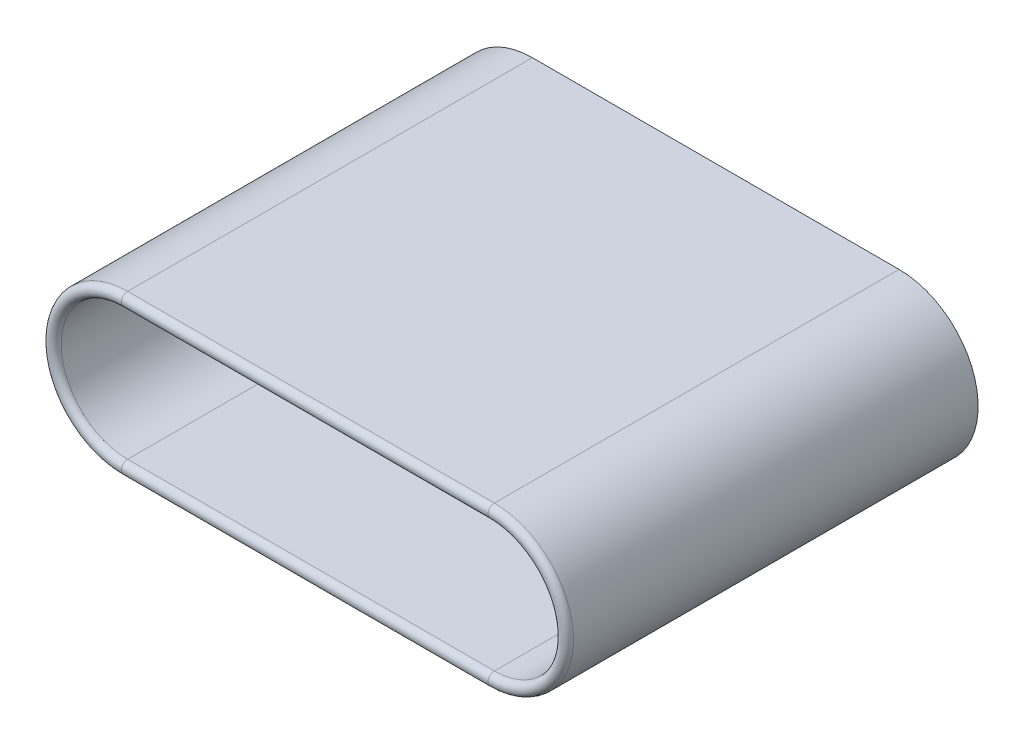
ISO-10303-21;
HEADER;
FILE_DESCRIPTION(('STEP AP214'),'2;1');
FILE_NAME('part.step','',(''),(''),'','','');
FILE_SCHEMA(('AUTOMOTIVE_DESIGN { 1 0 10303 214 1 1 1 1 }'));
ENDSEC;
DATA;
#1=APPLICATION_CONTEXT('core data for automotive mechanical design processes');
#2=APPLICATION_PROTOCOL_DEFINITION('international standard','automotive_design',2000,#1);
#3=PRODUCT_CONTEXT('',#1,'mechanical');
#4=PRODUCT('Part','Part','',(#3));
#5=PRODUCT_RELATED_PRODUCT_CATEGORY('part','',(#4));
#6=PRODUCT_DEFINITION_FORMATION('','',#4);
#7=PRODUCT_DEFINITION_CONTEXT('part definition',#1,'design');
#8=PRODUCT_DEFINITION('design','',#6,#7);
#9=PRODUCT_DEFINITION_SHAPE('','',#8);
#10=(LENGTH_UNIT() NAMED_UNIT(*) SI_UNIT(.MILLI.,.METRE.));
#11=(NAMED_UNIT(*) PLANE_ANGLE_UNIT() SI_UNIT($,.RADIAN.));
#12=(NAMED_UNIT(*) SI_UNIT($,.STERADIAN.) SOLID_ANGLE_UNIT());
#13=UNCERTAINTY_MEASURE_WITH_UNIT(LENGTH_MEASURE(1.E-05),#10,'distance_accuracy_value','');
#14=(GEOMETRIC_REPRESENTATION_CONTEXT(3) GLOBAL_UNCERTAINTY_ASSIGNED_CONTEXT((#13)) GLOBAL_UNIT_ASSIGNED_CONTEXT((#10,
#11,#12)) REPRESENTATION_CONTEXT('',''));
#15=CARTESIAN_POINT('',(0.,0.,0.));
#16=DIRECTION('',(0.,0.,1.));
#17=DIRECTION('',(1.,0.,0.));
#18=AXIS2_PLACEMENT_3D('',#15,#16,#17);
#19=CARTESIAN_POINT('',(2.9,1.05,0.));
#20=DIRECTION('',(0.,1.,0.));
#21=DIRECTION('',(-1.,0.,0.));
#22=AXIS2_PLACEMENT_3D('',#19,#20,#21);
#23=PLANE('',#22);
#24=DIRECTION('',(0.,0.,1.));
#25=VECTOR('',#24,1.);
#26=CARTESIAN_POINT('',(-2.9,1.05,0.));
#27=LINE('',#26,#25);
#28=CARTESIAN_POINT('',(-2.9,1.05,3.15));
#29=VERTEX_POINT('',#28);
#30=CARTESIAN_POINT('',(-2.9,1.05,-3.05));
#31=VERTEX_POINT('',#30);
#32=EDGE_CURVE('E62',#29,#31,#27,.F.);
#33=ORIENTED_EDGE('',*,*,#32,.T.);
#34=DIRECTION('',(-1.,0.,0.));
#35=VECTOR('',#34,1.);
#36=CARTESIAN_POINT('',(0.,1.05,-3.05));
#37=LINE('',#36,#35);
#38=CARTESIAN_POINT('',(2.9,1.05,-3.05));
#39=VERTEX_POINT('',#38);
#40=EDGE_CURVE('E65',#31,#39,#37,.F.);
#41=ORIENTED_EDGE('',*,*,#40,.T.);
#42=DIRECTION('',(0.,0.,1.));
#43=VECTOR('',#42,1.);
#44=CARTESIAN_POINT('',(2.9,1.05,0.));
#45=LINE('',#44,#43);
#46=CARTESIAN_POINT('',(2.9,1.05,3.15));
#47=VERTEX_POINT('',#46);
#48=EDGE_CURVE('E87',#39,#47,#45,.T.);
#49=ORIENTED_EDGE('',*,*,#48,.T.);
#50=DIRECTION('',(1.,0.,0.));
#51=VECTOR('',#50,1.);
#52=CARTESIAN_POINT('',(1.45,1.05,3.15));
#53=LINE('',#52,#51);
#54=EDGE_CURVE('E68',#29,#47,#53,.T.);
#55=ORIENTED_EDGE('',*,*,#54,.F.);
#56=EDGE_LOOP('',(#33,#41,#49,#55));
#57=FACE_BOUND('',#56,.T.);
#58=ADVANCED_FACE('F17',(#57),#23,.F.);
#59=CARTESIAN_POINT('',(0.,0.,-3.05));
#60=DIRECTION('',(0.,0.,-1.));
#61=DIRECTION('',(-1.,0.,0.));
#62=AXIS2_PLACEMENT_3D('',#59,#60,#61);
#63=PLANE('',#62);
#64=CARTESIAN_POINT('',(2.9,0.,-3.05));
#65=DIRECTION('',(0.,0.,1.));
#66=DIRECTION('',(1.,0.,0.));
#67=AXIS2_PLACEMENT_3D('',#64,#65,#66);
#68=CIRCLE('',#67,1.05);
#69=CARTESIAN_POINT('',(2.9,-1.05,-3.05));
#70=VERTEX_POINT('',#69);
#71=EDGE_CURVE('E80',#70,#39,#68,.T.);
#72=ORIENTED_EDGE('',*,*,#71,.T.);
#73=ORIENTED_EDGE('',*,*,#40,.F.);
#74=CARTESIAN_POINT('',(-2.9,0.,-3.05));
#75=DIRECTION('',(0.,0.,1.));
#76=DIRECTION('',(1.,0.,0.));
#77=AXIS2_PLACEMENT_3D('',#74,#75,#76);
#78=CIRCLE('',#77,1.05);
#79=CARTESIAN_POINT('',(-2.9,-1.05,-3.05));
#80=VERTEX_POINT('',#79);
#81=EDGE_CURVE('E20',#31,#80,#78,.T.);
#82=ORIENTED_EDGE('',*,*,#81,.T.);
#83=DIRECTION('',(1.,0.,0.));
#84=VECTOR('',#83,1.);
#85=CARTESIAN_POINT('',(-2.9,-1.05,-3.05));
#86=LINE('',#85,#84);
#87=EDGE_CURVE('E98',#80,#70,#86,.T.);
#88=ORIENTED_EDGE('',*,*,#87,.T.);
#89=EDGE_LOOP('',(#72,#73,#82,#88));
#90=FACE_BOUND('',#89,.T.);
#91=ADVANCED_FACE('F77',(#90),#63,.F.);
#92=CARTESIAN_POINT('',(-2.9,0.,0.));
#93=DIRECTION('',(0.,0.,1.));
#94=DIRECTION('',(1.,0.,0.));
#95=AXIS2_PLACEMENT_3D('',#92,#93,#94);
#96=CYLINDRICAL_SURFACE('',#95,1.05);
#97=DIRECTION('',(0.,0.,1.));
#98=VECTOR('',#97,1.);
#99=CARTESIAN_POINT('',(-2.9,-1.05,0.));
#100=LINE('',#99,#98);
#101=CARTESIAN_POINT('',(-2.9,-1.05,3.15));
#102=VERTEX_POINT('',#101);
#103=EDGE_CURVE('E85',#102,#80,#100,.F.);
#104=ORIENTED_EDGE('',*,*,#103,.T.);
#105=ORIENTED_EDGE('',*,*,#81,.F.);
#106=ORIENTED_EDGE('',*,*,#32,.F.);
#107=CARTESIAN_POINT('',(-2.9,0.,3.15));
#108=DIRECTION('',(0.,0.,-1.));
#109=DIRECTION('',(-1.,0.,0.));
#110=AXIS2_PLACEMENT_3D('',#107,#108,#109);
#111=CIRCLE('',#110,1.05);
#112=EDGE_CURVE('E113',#102,#29,#111,.T.);
#113=ORIENTED_EDGE('',*,*,#112,.F.);
#114=EDGE_LOOP('',(#104,#105,#106,#113));
#115=FACE_BOUND('',#114,.T.);
#116=ADVANCED_FACE('F83',(#115),#96,.F.);
#117=CARTESIAN_POINT('',(2.9,0.,0.));
#118=DIRECTION('',(0.,0.,1.));
#119=DIRECTION('',(1.,0.,0.));
#120=AXIS2_PLACEMENT_3D('',#117,#118,#119);
#121=CYLINDRICAL_SURFACE('',#120,1.05);
#122=ORIENTED_EDGE('',*,*,#48,.F.);
#123=ORIENTED_EDGE('',*,*,#71,.F.);
#124=DIRECTION('',(0.,0.,1.));
#125=VECTOR('',#124,1.);
#126=CARTESIAN_POINT('',(2.9,-1.05,0.));
#127=LINE('',#126,#125);
#128=CARTESIAN_POINT('',(2.9,-1.05,3.15));
#129=VERTEX_POINT('',#128);
#130=EDGE_CURVE('E100',#70,#129,#127,.T.);
#131=ORIENTED_EDGE('',*,*,#130,.T.);
#132=CARTESIAN_POINT('',(2.9,0.,3.15));
#133=DIRECTION('',(0.,0.,-1.));
#134=DIRECTION('',(-1.,0.,0.));
#135=AXIS2_PLACEMENT_3D('',#132,#133,#134);
#136=CIRCLE('',#135,1.05);
#137=EDGE_CURVE('E130',#47,#129,#136,.T.);
#138=ORIENTED_EDGE('',*,*,#137,.F.);
#139=EDGE_LOOP('',(#122,#123,#131,#138));
#140=FACE_BOUND('',#139,.T.);
#141=ADVANCED_FACE('F158',(#140),#121,.F.);
#142=CARTESIAN_POINT('',(1.45,1.15,3.15));
#143=DIRECTION('',(1.,0.,0.));
#144=DIRECTION('',(0.,1.,0.));
#145=AXIS2_PLACEMENT_3D('',#142,#143,#144);
#146=CYLINDRICAL_SURFACE('',#145,0.1);
#147=CARTESIAN_POINT('',(-2.9,1.15,3.15));
#148=DIRECTION('',(1.,0.,0.));
#149=DIRECTION('',(0.,1.,0.));
#150=AXIS2_PLACEMENT_3D('',#147,#148,#149);
#151=CIRCLE('',#150,0.1);
#152=CARTESIAN_POINT('',(-2.9,1.25,3.15));
#153=VERTEX_POINT('',#152);
#154=EDGE_CURVE('E116',#29,#153,#151,.F.);
#155=ORIENTED_EDGE('',*,*,#154,.F.);
#156=ORIENTED_EDGE('',*,*,#54,.T.);
#157=CARTESIAN_POINT('',(2.9,1.15,3.15));
#158=DIRECTION('',(1.,0.,0.));
#159=DIRECTION('',(0.,1.,0.));
#160=AXIS2_PLACEMENT_3D('',#157,#158,#159);
#161=CIRCLE('',#160,0.1);
#162=CARTESIAN_POINT('',(2.9,1.25,3.15));
#163=VERTEX_POINT('',#162);
#164=EDGE_CURVE('E115',#163,#47,#161,.T.);
#165=ORIENTED_EDGE('',*,*,#164,.F.);
#166=DIRECTION('',(-1.,0.,0.));
#167=VECTOR('',#166,1.);
#168=CARTESIAN_POINT('',(2.9,1.25,3.15));
#169=LINE('',#168,#167);
#170=EDGE_CURVE('E133',#153,#163,#169,.F.);
#171=ORIENTED_EDGE('',*,*,#170,.F.);
#172=EDGE_LOOP('',(#155,#156,#165,#171));
#173=FACE_BOUND('',#172,.T.);
#174=ADVANCED_FACE('F154',(#173),#146,.T.);
#175=CARTESIAN_POINT('',(-2.9,-1.05,0.));
#176=DIRECTION('',(0.,-1.,0.));
#177=DIRECTION('',(1.,0.,0.));
#178=AXIS2_PLACEMENT_3D('',#175,#176,#177);
#179=PLANE('',#178);
#180=ORIENTED_EDGE('',*,*,#130,.F.);
#181=ORIENTED_EDGE('',*,*,#87,.F.);
#182=ORIENTED_EDGE('',*,*,#103,.F.);
#183=DIRECTION('',(-1.,0.,0.));
#184=VECTOR('',#183,1.);
#185=CARTESIAN_POINT('',(-1.45,-1.05,3.15));
#186=LINE('',#185,#184);
#187=EDGE_CURVE('E123',#129,#102,#186,.T.);
#188=ORIENTED_EDGE('',*,*,#187,.F.);
#189=EDGE_LOOP('',(#180,#181,#182,#188));
#190=FACE_BOUND('',#189,.T.);
#191=ADVANCED_FACE('F148',(#190),#179,.F.);
#192=CARTESIAN_POINT('',(-2.9,0.,3.15));
#193=DIRECTION('',(0.,0.,-1.));
#194=DIRECTION('',(-1.,0.,0.));
#195=AXIS2_PLACEMENT_3D('',#192,#193,#194);
#196=TOROIDAL_SURFACE('',#195,1.15,0.1);
#197=CARTESIAN_POINT('',(-2.9,-1.15,3.15));
#198=DIRECTION('',(-1.,0.,0.));
#199=DIRECTION('',(0.,-1.,0.));
#200=AXIS2_PLACEMENT_3D('',#197,#198,#199);
#201=CIRCLE('',#200,0.1);
#202=CARTESIAN_POINT('',(-2.9,-1.25,3.15));
#203=VERTEX_POINT('',#202);
#204=EDGE_CURVE('E215',#102,#203,#201,.F.);
#205=ORIENTED_EDGE('',*,*,#204,.F.);
#206=ORIENTED_EDGE('',*,*,#112,.T.);
#207=ORIENTED_EDGE('',*,*,#154,.T.);
#208=CARTESIAN_POINT('',(-2.9,0.,3.15));
#209=DIRECTION('',(0.,0.,1.));
#210=DIRECTION('',(1.,0.,0.));
#211=AXIS2_PLACEMENT_3D('',#208,#209,#210);
#212=CIRCLE('',#211,1.25);
#213=EDGE_CURVE('E126',#203,#153,#212,.F.);
#214=ORIENTED_EDGE('',*,*,#213,.F.);
#215=EDGE_LOOP('',(#205,#206,#207,#214));
#216=FACE_BOUND('',#215,.T.);
#217=ADVANCED_FACE('F143',(#216),#196,.T.);
#218=CARTESIAN_POINT('',(2.9,0.,3.15));
#219=DIRECTION('',(0.,0.,-1.));
#220=DIRECTION('',(-1.,0.,0.));
#221=AXIS2_PLACEMENT_3D('',#218,#219,#220);
#222=TOROIDAL_SURFACE('',#221,1.15,0.1);
#223=CARTESIAN_POINT('',(2.9,-1.15,3.15));
#224=DIRECTION('',(-1.,0.,0.));
#225=DIRECTION('',(0.,-1.,0.));
#226=AXIS2_PLACEMENT_3D('',#223,#224,#225);
#227=CIRCLE('',#226,0.1);
#228=CARTESIAN_POINT('',(2.9,-1.25,3.15));
#229=VERTEX_POINT('',#228);
#230=EDGE_CURVE('E127',#229,#129,#227,.T.);
#231=ORIENTED_EDGE('',*,*,#230,.F.);
#232=CARTESIAN_POINT('',(2.9,0.,3.15));
#233=DIRECTION('',(0.,0.,1.));
#234=DIRECTION('',(1.,0.,0.));
#235=AXIS2_PLACEMENT_3D('',#232,#233,#234);
#236=CIRCLE('',#235,1.25);
#237=EDGE_CURVE('E96',#163,#229,#236,.F.);
#238=ORIENTED_EDGE('',*,*,#237,.F.);
#239=ORIENTED_EDGE('',*,*,#164,.T.);
#240=ORIENTED_EDGE('',*,*,#137,.T.);
#241=EDGE_LOOP('',(#231,#238,#239,#240));
#242=FACE_BOUND('',#241,.T.);
#243=ADVANCED_FACE('F147',(#242),#222,.T.);
#244=CARTESIAN_POINT('',(2.9,1.25,0.));
#245=DIRECTION('',(0.,1.,0.));
#246=DIRECTION('',(-1.,0.,0.));
#247=AXIS2_PLACEMENT_3D('',#244,#245,#246);
#248=PLANE('',#247);
#249=DIRECTION('',(-1.,0.,0.));
#250=VECTOR('',#249,1.);
#251=CARTESIAN_POINT('',(0.,1.25,-3.25));
#252=LINE('',#251,#250);
#253=CARTESIAN_POINT('',(-2.9,1.25,-3.25));
#254=VERTEX_POINT('',#253);
#255=CARTESIAN_POINT('',(2.9,1.25,-3.25));
#256=VERTEX_POINT('',#255);
#257=EDGE_CURVE('E93',#254,#256,#252,.F.);
#258=ORIENTED_EDGE('',*,*,#257,.F.);
#259=DIRECTION('',(0.,0.,1.));
#260=VECTOR('',#259,1.);
#261=CARTESIAN_POINT('',(-2.9,1.25,0.));
#262=LINE('',#261,#260);
#263=EDGE_CURVE('E94',#153,#254,#262,.F.);
#264=ORIENTED_EDGE('',*,*,#263,.F.);
#265=ORIENTED_EDGE('',*,*,#170,.T.);
#266=DIRECTION('',(0.,0.,1.));
#267=VECTOR('',#266,1.);
#268=CARTESIAN_POINT('',(2.9,1.25,0.));
#269=LINE('',#268,#267);
#270=EDGE_CURVE('E95',#256,#163,#269,.T.);
#271=ORIENTED_EDGE('',*,*,#270,.F.);
#272=EDGE_LOOP('',(#258,#264,#265,#271));
#273=FACE_BOUND('',#272,.T.);
#274=ADVANCED_FACE('F190',(#273),#248,.T.);
#275=CARTESIAN_POINT('',(-1.45,-1.15,3.15));
#276=DIRECTION('',(-1.,0.,0.));
#277=DIRECTION('',(0.,-1.,0.));
#278=AXIS2_PLACEMENT_3D('',#275,#276,#277);
#279=CYLINDRICAL_SURFACE('',#278,0.1);
#280=ORIENTED_EDGE('',*,*,#230,.T.);
#281=ORIENTED_EDGE('',*,*,#187,.T.);
#282=ORIENTED_EDGE('',*,*,#204,.T.);
#283=DIRECTION('',(1.,0.,0.));
#284=VECTOR('',#283,1.);
#285=CARTESIAN_POINT('',(-2.9,-1.25,3.15));
#286=LINE('',#285,#284);
#287=EDGE_CURVE('E224',#229,#203,#286,.F.);
#288=ORIENTED_EDGE('',*,*,#287,.F.);
#289=EDGE_LOOP('',(#280,#281,#282,#288));
#290=FACE_BOUND('',#289,.T.);
#291=ADVANCED_FACE('F187',(#290),#279,.T.);
#292=CARTESIAN_POINT('',(-2.9,0.,0.));
#293=DIRECTION('',(0.,0.,1.));
#294=DIRECTION('',(1.,0.,0.));
#295=AXIS2_PLACEMENT_3D('',#292,#293,#294);
#296=CYLINDRICAL_SURFACE('',#295,1.25);
#297=CARTESIAN_POINT('',(-2.9,0.,-3.25));
#298=DIRECTION('',(0.,0.,1.));
#299=DIRECTION('',(1.,0.,0.));
#300=AXIS2_PLACEMENT_3D('',#297,#298,#299);
#301=CIRCLE('',#300,1.25);
#302=CARTESIAN_POINT('',(-2.9,-1.25,-3.25));
#303=VERTEX_POINT('',#302);
#304=EDGE_CURVE('E90',#303,#254,#301,.F.);
#305=ORIENTED_EDGE('',*,*,#304,.F.);
#306=DIRECTION('',(0.,0.,1.));
#307=VECTOR('',#306,1.);
#308=CARTESIAN_POINT('',(-2.9,-1.25,0.));
#309=LINE('',#308,#307);
#310=EDGE_CURVE('E207',#203,#303,#309,.F.);
#311=ORIENTED_EDGE('',*,*,#310,.F.);
#312=ORIENTED_EDGE('',*,*,#213,.T.);
#313=ORIENTED_EDGE('',*,*,#263,.T.);
#314=EDGE_LOOP('',(#305,#311,#312,#313));
#315=FACE_BOUND('',#314,.T.);
#316=ADVANCED_FACE('F184',(#315),#296,.T.);
#317=CARTESIAN_POINT('',(0.,0.,-3.25));
#318=DIRECTION('',(0.,0.,-1.));
#319=DIRECTION('',(-1.,0.,0.));
#320=AXIS2_PLACEMENT_3D('',#317,#318,#319);
#321=PLANE('',#320);
#322=ORIENTED_EDGE('',*,*,#257,.T.);
#323=CARTESIAN_POINT('',(2.9,0.,-3.25));
#324=DIRECTION('',(0.,0.,1.));
#325=DIRECTION('',(1.,0.,0.));
#326=AXIS2_PLACEMENT_3D('',#323,#324,#325);
#327=CIRCLE('',#326,1.25);
#328=CARTESIAN_POINT('',(2.9,-1.25,-3.25));
#329=VERTEX_POINT('',#328);
#330=EDGE_CURVE('E35',#329,#256,#327,.T.);
#331=ORIENTED_EDGE('',*,*,#330,.F.);
#332=DIRECTION('',(1.,0.,0.));
#333=VECTOR('',#332,1.);
#334=CARTESIAN_POINT('',(-2.9,-1.25,-3.25));
#335=LINE('',#334,#333);
#336=EDGE_CURVE('E26',#303,#329,#335,.T.);
#337=ORIENTED_EDGE('',*,*,#336,.F.);
#338=ORIENTED_EDGE('',*,*,#304,.T.);
#339=EDGE_LOOP('',(#322,#331,#337,#338));
#340=FACE_BOUND('',#339,.T.);
#341=ADVANCED_FACE('F177',(#340),#321,.T.);
#342=CARTESIAN_POINT('',(2.9,0.,0.));
#343=DIRECTION('',(0.,0.,1.));
#344=DIRECTION('',(1.,0.,0.));
#345=AXIS2_PLACEMENT_3D('',#342,#343,#344);
#346=CYLINDRICAL_SURFACE('',#345,1.25);
#347=ORIENTED_EDGE('',*,*,#330,.T.);
#348=ORIENTED_EDGE('',*,*,#270,.T.);
#349=ORIENTED_EDGE('',*,*,#237,.T.);
#350=DIRECTION('',(0.,0.,1.));
#351=VECTOR('',#350,1.);
#352=CARTESIAN_POINT('',(2.9,-1.25,0.));
#353=LINE('',#352,#351);
#354=EDGE_CURVE('E11',#329,#229,#353,.T.);
#355=ORIENTED_EDGE('',*,*,#354,.F.);
#356=EDGE_LOOP('',(#347,#348,#349,#355));
#357=FACE_BOUND('',#356,.T.);
#358=ADVANCED_FACE('F171',(#357),#346,.T.);
#359=CARTESIAN_POINT('',(-2.9,-1.25,0.));
#360=DIRECTION('',(0.,-1.,0.));
#361=DIRECTION('',(1.,0.,0.));
#362=AXIS2_PLACEMENT_3D('',#359,#360,#361);
#363=PLANE('',#362);
#364=ORIENTED_EDGE('',*,*,#336,.T.);
#365=ORIENTED_EDGE('',*,*,#354,.T.);
#366=ORIENTED_EDGE('',*,*,#287,.T.);
#367=ORIENTED_EDGE('',*,*,#310,.T.);
#368=EDGE_LOOP('',(#364,#365,#366,#367));
#369=FACE_BOUND('',#368,.T.);
#370=ADVANCED_FACE('F169',(#369),#363,.T.);
#371=CLOSED_SHELL('',(#58,#91,#116,#141,#174,#191,#217,#243,#274,#291,#316,#341,#358,#370));
#372=MANIFOLD_SOLID_BREP('B1',#371);
#373=ADVANCED_BREP_SHAPE_REPRESENTATION('',(#18,#372),#14);
#374=SHAPE_DEFINITION_REPRESENTATION(#9,#373);
ENDSEC;
END-ISO-10303-21;
